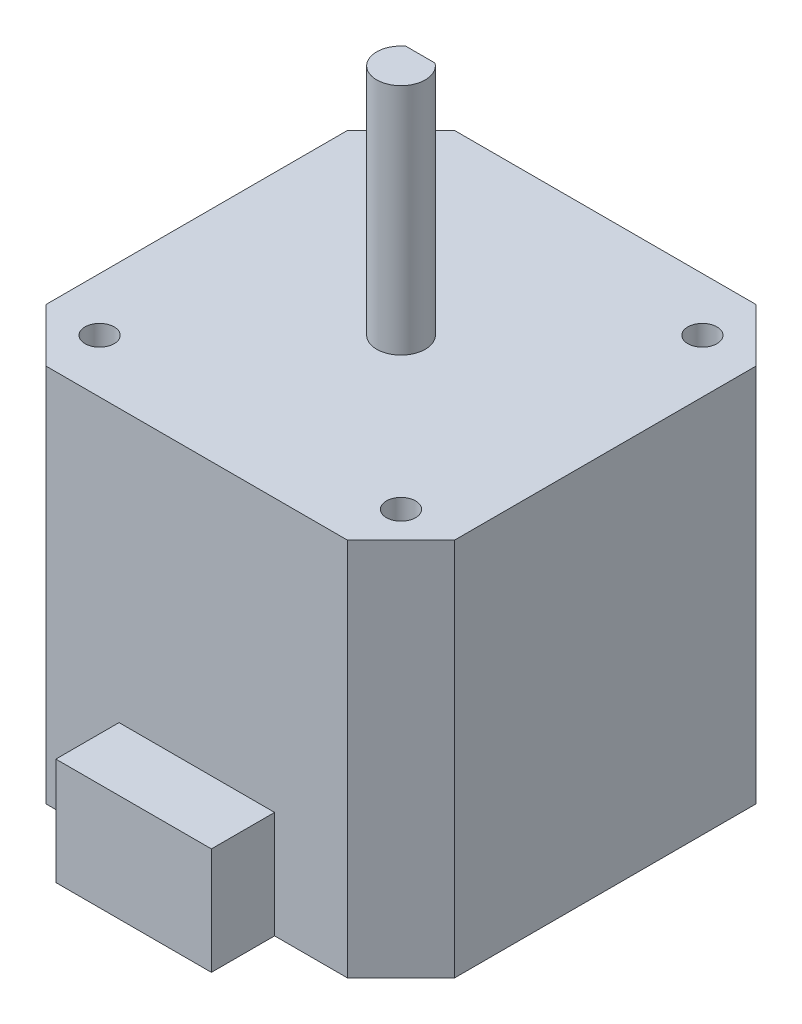
ISO-10303-21;
HEADER;
FILE_DESCRIPTION(('STEP AP214'),'2;1');
FILE_NAME('part.step','',(''),(''),'','','');
FILE_SCHEMA(('AUTOMOTIVE_DESIGN { 1 0 10303 214 1 1 1 1 }'));
ENDSEC;
DATA;
#1=APPLICATION_CONTEXT('core data for automotive mechanical design processes');
#2=APPLICATION_PROTOCOL_DEFINITION('international standard','automotive_design',2000,#1);
#3=PRODUCT_CONTEXT('',#1,'mechanical');
#4=PRODUCT('Part','Part','',(#3));
#5=PRODUCT_RELATED_PRODUCT_CATEGORY('part','',(#4));
#6=PRODUCT_DEFINITION_FORMATION('','',#4);
#7=PRODUCT_DEFINITION_CONTEXT('part definition',#1,'design');
#8=PRODUCT_DEFINITION('design','',#6,#7);
#9=PRODUCT_DEFINITION_SHAPE('','',#8);
#10=(LENGTH_UNIT() NAMED_UNIT(*) SI_UNIT(.MILLI.,.METRE.));
#11=(NAMED_UNIT(*) PLANE_ANGLE_UNIT() SI_UNIT($,.RADIAN.));
#12=(NAMED_UNIT(*) SI_UNIT($,.STERADIAN.) SOLID_ANGLE_UNIT());
#13=UNCERTAINTY_MEASURE_WITH_UNIT(LENGTH_MEASURE(1.E-05),#10,'distance_accuracy_value','');
#14=(GEOMETRIC_REPRESENTATION_CONTEXT(3) GLOBAL_UNCERTAINTY_ASSIGNED_CONTEXT((#13)) GLOBAL_UNIT_ASSIGNED_CONTEXT((#10,
#11,#12)) REPRESENTATION_CONTEXT('',''));
#15=CARTESIAN_POINT('',(0.,0.,0.));
#16=DIRECTION('',(0.,0.,1.));
#17=DIRECTION('',(1.,0.,0.));
#18=AXIS2_PLACEMENT_3D('',#15,#16,#17);
#19=CARTESIAN_POINT('',(-15.5,39.,21.));
#20=DIRECTION('',(0.,0.,-1.));
#21=DIRECTION('',(-1.,0.,0.));
#22=AXIS2_PLACEMENT_3D('',#19,#20,#21);
#23=PLANE('',#22);
#24=DIRECTION('',(0.,-1.,0.));
#25=VECTOR('',#24,1.);
#26=CARTESIAN_POINT('',(-8.,0.,21.));
#27=LINE('',#26,#25);
#28=CARTESIAN_POINT('',(-8.,11.,21.));
#29=VERTEX_POINT('',#28);
#30=CARTESIAN_POINT('',(-8.,0.,21.));
#31=VERTEX_POINT('',#30);
#32=EDGE_CURVE('E57',#29,#31,#27,.T.);
#33=ORIENTED_EDGE('',*,*,#32,.F.);
#34=DIRECTION('',(-1.,0.,0.));
#35=VECTOR('',#34,1.);
#36=CARTESIAN_POINT('',(-8.,11.,21.));
#37=LINE('',#36,#35);
#38=CARTESIAN_POINT('',(8.,11.,21.));
#39=VERTEX_POINT('',#38);
#40=EDGE_CURVE('E163',#39,#29,#37,.T.);
#41=ORIENTED_EDGE('',*,*,#40,.F.);
#42=DIRECTION('',(0.,1.,0.));
#43=VECTOR('',#42,1.);
#44=CARTESIAN_POINT('',(8.,0.,21.));
#45=LINE('',#44,#43);
#46=CARTESIAN_POINT('',(8.,0.,21.));
#47=VERTEX_POINT('',#46);
#48=EDGE_CURVE('E63',#47,#39,#45,.T.);
#49=ORIENTED_EDGE('',*,*,#48,.F.);
#50=DIRECTION('',(1.,0.,0.));
#51=VECTOR('',#50,1.);
#52=CARTESIAN_POINT('',(-15.5,0.,21.));
#53=LINE('',#52,#51);
#54=CARTESIAN_POINT('',(15.5,0.,21.));
#55=VERTEX_POINT('',#54);
#56=EDGE_CURVE('E235',#47,#55,#53,.T.);
#57=ORIENTED_EDGE('',*,*,#56,.T.);
#58=DIRECTION('',(0.,-1.,0.));
#59=VECTOR('',#58,1.);
#60=CARTESIAN_POINT('',(15.5,39.,21.));
#61=LINE('',#60,#59);
#62=CARTESIAN_POINT('',(15.5,39.,21.));
#63=VERTEX_POINT('',#62);
#64=EDGE_CURVE('E261',#63,#55,#61,.T.);
#65=ORIENTED_EDGE('',*,*,#64,.F.);
#66=DIRECTION('',(1.,0.,0.));
#67=VECTOR('',#66,1.);
#68=CARTESIAN_POINT('',(-15.5,39.,21.));
#69=LINE('',#68,#67);
#70=CARTESIAN_POINT('',(-15.5,39.,21.));
#71=VERTEX_POINT('',#70);
#72=EDGE_CURVE('E218',#71,#63,#69,.T.);
#73=ORIENTED_EDGE('',*,*,#72,.F.);
#74=DIRECTION('',(0.,-1.,0.));
#75=VECTOR('',#74,1.);
#76=CARTESIAN_POINT('',(-15.5,39.,21.));
#77=LINE('',#76,#75);
#78=CARTESIAN_POINT('',(-15.5,0.,21.));
#79=VERTEX_POINT('',#78);
#80=EDGE_CURVE('E264',#71,#79,#77,.T.);
#81=ORIENTED_EDGE('',*,*,#80,.T.);
#82=EDGE_CURVE('E236',#79,#31,#53,.T.);
#83=ORIENTED_EDGE('',*,*,#82,.T.);
#84=EDGE_LOOP('',(#33,#41,#49,#57,#65,#73,#81,#83));
#85=FACE_BOUND('',#84,.T.);
#86=ADVANCED_FACE('F42',(#85),#23,.F.);
#87=CARTESIAN_POINT('',(-21.,39.,15.5));
#88=DIRECTION('',(1.,0.,0.));
#89=DIRECTION('',(0.,0.,-1.));
#90=AXIS2_PLACEMENT_3D('',#87,#88,#89);
#91=PLANE('',#90);
#92=DIRECTION('',(0.,0.,1.));
#93=VECTOR('',#92,1.);
#94=CARTESIAN_POINT('',(-21.,0.,15.5));
#95=LINE('',#94,#93);
#96=CARTESIAN_POINT('',(-21.,0.,-15.5));
#97=VERTEX_POINT('',#96);
#98=CARTESIAN_POINT('',(-21.,0.,15.5));
#99=VERTEX_POINT('',#98);
#100=EDGE_CURVE('E211',#97,#99,#95,.T.);
#101=ORIENTED_EDGE('',*,*,#100,.T.);
#102=DIRECTION('',(0.,-1.,0.));
#103=VECTOR('',#102,1.);
#104=CARTESIAN_POINT('',(-21.,39.,15.5));
#105=LINE('',#104,#103);
#106=CARTESIAN_POINT('',(-21.,39.,15.5));
#107=VERTEX_POINT('',#106);
#108=EDGE_CURVE('E50',#107,#99,#105,.T.);
#109=ORIENTED_EDGE('',*,*,#108,.F.);
#110=DIRECTION('',(0.,0.,1.));
#111=VECTOR('',#110,1.);
#112=CARTESIAN_POINT('',(-21.,39.,15.5));
#113=LINE('',#112,#111);
#114=CARTESIAN_POINT('',(-21.,39.,-15.5));
#115=VERTEX_POINT('',#114);
#116=EDGE_CURVE('E212',#115,#107,#113,.T.);
#117=ORIENTED_EDGE('',*,*,#116,.F.);
#118=DIRECTION('',(0.,-1.,0.));
#119=VECTOR('',#118,1.);
#120=CARTESIAN_POINT('',(-21.,39.,-15.5));
#121=LINE('',#120,#119);
#122=EDGE_CURVE('E230',#115,#97,#121,.T.);
#123=ORIENTED_EDGE('',*,*,#122,.T.);
#124=EDGE_LOOP('',(#101,#109,#117,#123));
#125=FACE_BOUND('',#124,.T.);
#126=ADVANCED_FACE('F44',(#125),#91,.F.);
#127=CARTESIAN_POINT('',(-21.,39.,15.5));
#128=DIRECTION('',(0.707106781186549,0.,-0.707106781186546));
#129=DIRECTION('',(-0.707106781186546,0.,-0.707106781186549));
#130=AXIS2_PLACEMENT_3D('',#127,#128,#129);
#131=PLANE('',#130);
#132=DIRECTION('',(0.707106781186546,0.,0.707106781186549));
#133=VECTOR('',#132,1.);
#134=CARTESIAN_POINT('',(-21.,0.,15.5));
#135=LINE('',#134,#133);
#136=EDGE_CURVE('E233',#99,#79,#135,.T.);
#137=ORIENTED_EDGE('',*,*,#136,.T.);
#138=ORIENTED_EDGE('',*,*,#80,.F.);
#139=DIRECTION('',(0.707106781186546,0.,0.707106781186549));
#140=VECTOR('',#139,1.);
#141=CARTESIAN_POINT('',(-21.,39.,15.5));
#142=LINE('',#141,#140);
#143=EDGE_CURVE('E215',#107,#71,#142,.T.);
#144=ORIENTED_EDGE('',*,*,#143,.F.);
#145=ORIENTED_EDGE('',*,*,#108,.T.);
#146=EDGE_LOOP('',(#137,#138,#144,#145));
#147=FACE_BOUND('',#146,.T.);
#148=ADVANCED_FACE('F269',(#147),#131,.F.);
#149=CARTESIAN_POINT('',(15.5,39.,21.));
#150=DIRECTION('',(-0.707106781186549,0.,-0.707106781186546));
#151=DIRECTION('',(-0.707106781186546,0.,0.707106781186549));
#152=AXIS2_PLACEMENT_3D('',#149,#150,#151);
#153=PLANE('',#152);
#154=DIRECTION('',(0.707106781186546,0.,-0.707106781186549));
#155=VECTOR('',#154,1.);
#156=CARTESIAN_POINT('',(15.5,0.,21.));
#157=LINE('',#156,#155);
#158=CARTESIAN_POINT('',(21.,0.,15.5));
#159=VERTEX_POINT('',#158);
#160=EDGE_CURVE('E238',#55,#159,#157,.T.);
#161=ORIENTED_EDGE('',*,*,#160,.T.);
#162=DIRECTION('',(0.,-1.,0.));
#163=VECTOR('',#162,1.);
#164=CARTESIAN_POINT('',(21.,39.,15.5));
#165=LINE('',#164,#163);
#166=CARTESIAN_POINT('',(21.,39.,15.5));
#167=VERTEX_POINT('',#166);
#168=EDGE_CURVE('E258',#167,#159,#165,.T.);
#169=ORIENTED_EDGE('',*,*,#168,.F.);
#170=DIRECTION('',(0.707106781186546,0.,-0.707106781186549));
#171=VECTOR('',#170,1.);
#172=CARTESIAN_POINT('',(15.5,39.,21.));
#173=LINE('',#172,#171);
#174=EDGE_CURVE('E220',#63,#167,#173,.T.);
#175=ORIENTED_EDGE('',*,*,#174,.F.);
#176=ORIENTED_EDGE('',*,*,#64,.T.);
#177=EDGE_LOOP('',(#161,#169,#175,#176));
#178=FACE_BOUND('',#177,.T.);
#179=ADVANCED_FACE('F301',(#178),#153,.F.);
#180=CARTESIAN_POINT('',(21.,39.,15.5));
#181=DIRECTION('',(-1.,0.,0.));
#182=DIRECTION('',(0.,0.,1.));
#183=AXIS2_PLACEMENT_3D('',#180,#181,#182);
#184=PLANE('',#183);
#185=DIRECTION('',(0.,0.,-1.));
#186=VECTOR('',#185,1.);
#187=CARTESIAN_POINT('',(21.,0.,15.5));
#188=LINE('',#187,#186);
#189=CARTESIAN_POINT('',(21.,0.,-15.5));
#190=VERTEX_POINT('',#189);
#191=EDGE_CURVE('E240',#159,#190,#188,.T.);
#192=ORIENTED_EDGE('',*,*,#191,.T.);
#193=DIRECTION('',(0.,-1.,0.));
#194=VECTOR('',#193,1.);
#195=CARTESIAN_POINT('',(21.,39.,-15.5));
#196=LINE('',#195,#194);
#197=CARTESIAN_POINT('',(21.,39.,-15.5));
#198=VERTEX_POINT('',#197);
#199=EDGE_CURVE('E255',#198,#190,#196,.T.);
#200=ORIENTED_EDGE('',*,*,#199,.F.);
#201=DIRECTION('',(0.,0.,-1.));
#202=VECTOR('',#201,1.);
#203=CARTESIAN_POINT('',(21.,39.,15.5));
#204=LINE('',#203,#202);
#205=EDGE_CURVE('E222',#167,#198,#204,.T.);
#206=ORIENTED_EDGE('',*,*,#205,.F.);
#207=ORIENTED_EDGE('',*,*,#168,.T.);
#208=EDGE_LOOP('',(#192,#200,#206,#207));
#209=FACE_BOUND('',#208,.T.);
#210=ADVANCED_FACE('F299',(#209),#184,.F.);
#211=CARTESIAN_POINT('',(15.5,39.,-21.));
#212=DIRECTION('',(-0.707106781186549,0.,0.707106781186546));
#213=DIRECTION('',(0.707106781186546,0.,0.707106781186549));
#214=AXIS2_PLACEMENT_3D('',#211,#212,#213);
#215=PLANE('',#214);
#216=DIRECTION('',(-0.707106781186546,0.,-0.707106781186549));
#217=VECTOR('',#216,1.);
#218=CARTESIAN_POINT('',(15.5,0.,-21.));
#219=LINE('',#218,#217);
#220=CARTESIAN_POINT('',(15.5,0.,-21.));
#221=VERTEX_POINT('',#220);
#222=EDGE_CURVE('E242',#190,#221,#219,.T.);
#223=ORIENTED_EDGE('',*,*,#222,.T.);
#224=DIRECTION('',(0.,-1.,0.));
#225=VECTOR('',#224,1.);
#226=CARTESIAN_POINT('',(15.5,39.,-21.));
#227=LINE('',#226,#225);
#228=CARTESIAN_POINT('',(15.5,39.,-21.));
#229=VERTEX_POINT('',#228);
#230=EDGE_CURVE('E252',#229,#221,#227,.T.);
#231=ORIENTED_EDGE('',*,*,#230,.F.);
#232=DIRECTION('',(-0.707106781186546,0.,-0.707106781186549));
#233=VECTOR('',#232,1.);
#234=CARTESIAN_POINT('',(15.5,39.,-21.));
#235=LINE('',#234,#233);
#236=EDGE_CURVE('E224',#198,#229,#235,.T.);
#237=ORIENTED_EDGE('',*,*,#236,.F.);
#238=ORIENTED_EDGE('',*,*,#199,.T.);
#239=EDGE_LOOP('',(#223,#231,#237,#238));
#240=FACE_BOUND('',#239,.T.);
#241=ADVANCED_FACE('F294',(#240),#215,.F.);
#242=CARTESIAN_POINT('',(-15.5,39.,-21.));
#243=DIRECTION('',(0.,0.,1.));
#244=DIRECTION('',(1.,0.,0.));
#245=AXIS2_PLACEMENT_3D('',#242,#243,#244);
#246=PLANE('',#245);
#247=DIRECTION('',(-1.,0.,0.));
#248=VECTOR('',#247,1.);
#249=CARTESIAN_POINT('',(-15.5,0.,-21.));
#250=LINE('',#249,#248);
#251=CARTESIAN_POINT('',(-15.5,0.,-21.));
#252=VERTEX_POINT('',#251);
#253=EDGE_CURVE('E244',#221,#252,#250,.T.);
#254=ORIENTED_EDGE('',*,*,#253,.T.);
#255=DIRECTION('',(0.,-1.,0.));
#256=VECTOR('',#255,1.);
#257=CARTESIAN_POINT('',(-15.5,39.,-21.));
#258=LINE('',#257,#256);
#259=CARTESIAN_POINT('',(-15.5,39.,-21.));
#260=VERTEX_POINT('',#259);
#261=EDGE_CURVE('E249',#260,#252,#258,.T.);
#262=ORIENTED_EDGE('',*,*,#261,.F.);
#263=DIRECTION('',(-1.,0.,0.));
#264=VECTOR('',#263,1.);
#265=CARTESIAN_POINT('',(-15.5,39.,-21.));
#266=LINE('',#265,#264);
#267=EDGE_CURVE('E226',#229,#260,#266,.T.);
#268=ORIENTED_EDGE('',*,*,#267,.F.);
#269=ORIENTED_EDGE('',*,*,#230,.T.);
#270=EDGE_LOOP('',(#254,#262,#268,#269));
#271=FACE_BOUND('',#270,.T.);
#272=ADVANCED_FACE('F288',(#271),#246,.F.);
#273=CARTESIAN_POINT('',(-21.,39.,-15.5));
#274=DIRECTION('',(0.707106781186549,0.,0.707106781186546));
#275=DIRECTION('',(0.707106781186546,0.,-0.707106781186549));
#276=AXIS2_PLACEMENT_3D('',#273,#274,#275);
#277=PLANE('',#276);
#278=DIRECTION('',(-0.707106781186546,0.,0.707106781186549));
#279=VECTOR('',#278,1.);
#280=CARTESIAN_POINT('',(-21.,0.,-15.5));
#281=LINE('',#280,#279);
#282=EDGE_CURVE('E216',#252,#97,#281,.T.);
#283=ORIENTED_EDGE('',*,*,#282,.T.);
#284=ORIENTED_EDGE('',*,*,#122,.F.);
#285=DIRECTION('',(-0.707106781186546,0.,0.707106781186549));
#286=VECTOR('',#285,1.);
#287=CARTESIAN_POINT('',(-21.,39.,-15.5));
#288=LINE('',#287,#286);
#289=EDGE_CURVE('E228',#260,#115,#288,.T.);
#290=ORIENTED_EDGE('',*,*,#289,.F.);
#291=ORIENTED_EDGE('',*,*,#261,.T.);
#292=EDGE_LOOP('',(#283,#284,#290,#291));
#293=FACE_BOUND('',#292,.T.);
#294=ADVANCED_FACE('F286',(#293),#277,.F.);
#295=CARTESIAN_POINT('',(0.,39.,0.));
#296=DIRECTION('',(0.,-1.,0.));
#297=DIRECTION('',(0.,0.,-1.));
#298=AXIS2_PLACEMENT_3D('',#295,#296,#297);
#299=PLANE('',#298);
#300=CARTESIAN_POINT('',(-15.5,39.,15.4999999999999));
#301=DIRECTION('',(0.,1.,0.));
#302=DIRECTION('',(0.,0.,1.));
#303=AXIS2_PLACEMENT_3D('',#300,#301,#302);
#304=CIRCLE('',#303,1.5);
#305=CARTESIAN_POINT('',(-15.5,39.,16.9999999999999));
#306=VERTEX_POINT('',#305);
#307=EDGE_CURVE('E169',#306,#306,#304,.T.);
#308=ORIENTED_EDGE('',*,*,#307,.F.);
#309=EDGE_LOOP('',(#308));
#310=FACE_BOUND('',#309,.T.);
#311=CARTESIAN_POINT('',(15.5,39.,15.4999999999999));
#312=DIRECTION('',(0.,1.,0.));
#313=DIRECTION('',(0.,0.,1.));
#314=AXIS2_PLACEMENT_3D('',#311,#312,#313);
#315=CIRCLE('',#314,1.5);
#316=CARTESIAN_POINT('',(15.5,39.,16.9999999999999));
#317=VERTEX_POINT('',#316);
#318=EDGE_CURVE('E182',#317,#317,#315,.T.);
#319=ORIENTED_EDGE('',*,*,#318,.F.);
#320=EDGE_LOOP('',(#319));
#321=FACE_BOUND('',#320,.T.);
#322=CARTESIAN_POINT('',(15.5,39.,-15.5));
#323=DIRECTION('',(0.,1.,0.));
#324=DIRECTION('',(0.,0.,1.));
#325=AXIS2_PLACEMENT_3D('',#322,#323,#324);
#326=CIRCLE('',#325,1.5);
#327=CARTESIAN_POINT('',(15.5,39.,-14.));
#328=VERTEX_POINT('',#327);
#329=EDGE_CURVE('E175',#328,#328,#326,.T.);
#330=ORIENTED_EDGE('',*,*,#329,.F.);
#331=EDGE_LOOP('',(#330));
#332=FACE_BOUND('',#331,.T.);
#333=CARTESIAN_POINT('',(-15.5,39.,-15.5));
#334=DIRECTION('',(0.,1.,0.));
#335=DIRECTION('',(0.,0.,1.));
#336=AXIS2_PLACEMENT_3D('',#333,#334,#335);
#337=CIRCLE('',#336,1.5);
#338=CARTESIAN_POINT('',(-15.5,39.,-14.));
#339=VERTEX_POINT('',#338);
#340=EDGE_CURVE('E178',#339,#339,#337,.T.);
#341=ORIENTED_EDGE('',*,*,#340,.F.);
#342=EDGE_LOOP('',(#341));
#343=FACE_BOUND('',#342,.T.);
#344=CARTESIAN_POINT('',(0.,39.,0.));
#345=DIRECTION('',(0.,-1.,0.));
#346=DIRECTION('',(0.,0.,-1.));
#347=AXIS2_PLACEMENT_3D('',#344,#345,#346);
#348=CIRCLE('',#347,2.5);
#349=CARTESIAN_POINT('',(0.,39.,-2.5));
#350=VERTEX_POINT('',#349);
#351=EDGE_CURVE('E11',#350,#350,#348,.F.);
#352=ORIENTED_EDGE('',*,*,#351,.F.);
#353=EDGE_LOOP('',(#352));
#354=FACE_BOUND('',#353,.T.);
#355=ORIENTED_EDGE('',*,*,#116,.T.);
#356=ORIENTED_EDGE('',*,*,#143,.T.);
#357=ORIENTED_EDGE('',*,*,#72,.T.);
#358=ORIENTED_EDGE('',*,*,#174,.T.);
#359=ORIENTED_EDGE('',*,*,#205,.T.);
#360=ORIENTED_EDGE('',*,*,#236,.T.);
#361=ORIENTED_EDGE('',*,*,#267,.T.);
#362=ORIENTED_EDGE('',*,*,#289,.T.);
#363=EDGE_LOOP('',(#355,#356,#357,#358,#359,#360,#361,#362));
#364=FACE_BOUND('',#363,.T.);
#365=ADVANCED_FACE('F280',(#310,#321,#332,#343,#354,#364),#299,.F.);
#366=CARTESIAN_POINT('',(0.,0.,0.));
#367=DIRECTION('',(0.,-1.,0.));
#368=DIRECTION('',(0.,0.,-1.));
#369=AXIS2_PLACEMENT_3D('',#366,#367,#368);
#370=PLANE('',#369);
#371=ORIENTED_EDGE('',*,*,#100,.F.);
#372=ORIENTED_EDGE('',*,*,#282,.F.);
#373=ORIENTED_EDGE('',*,*,#253,.F.);
#374=ORIENTED_EDGE('',*,*,#222,.F.);
#375=ORIENTED_EDGE('',*,*,#191,.F.);
#376=ORIENTED_EDGE('',*,*,#160,.F.);
#377=ORIENTED_EDGE('',*,*,#56,.F.);
#378=DIRECTION('',(0.,0.,-1.));
#379=VECTOR('',#378,1.);
#380=CARTESIAN_POINT('',(8.,0.,27.5));
#381=LINE('',#380,#379);
#382=CARTESIAN_POINT('',(8.,0.,27.5));
#383=VERTEX_POINT('',#382);
#384=EDGE_CURVE('E150',#383,#47,#381,.T.);
#385=ORIENTED_EDGE('',*,*,#384,.F.);
#386=DIRECTION('',(1.,0.,0.));
#387=VECTOR('',#386,1.);
#388=CARTESIAN_POINT('',(-8.,0.,27.5));
#389=LINE('',#388,#387);
#390=CARTESIAN_POINT('',(-8.,0.,27.5));
#391=VERTEX_POINT('',#390);
#392=EDGE_CURVE('E142',#391,#383,#389,.T.);
#393=ORIENTED_EDGE('',*,*,#392,.F.);
#394=DIRECTION('',(0.,0.,-1.));
#395=VECTOR('',#394,1.);
#396=CARTESIAN_POINT('',(-8.,0.,27.5));
#397=LINE('',#396,#395);
#398=EDGE_CURVE('E148',#391,#31,#397,.T.);
#399=ORIENTED_EDGE('',*,*,#398,.T.);
#400=ORIENTED_EDGE('',*,*,#82,.F.);
#401=ORIENTED_EDGE('',*,*,#136,.F.);
#402=EDGE_LOOP('',(#371,#372,#373,#374,#375,#376,#377,#385,#393,#399,#400,#401));
#403=FACE_BOUND('',#402,.T.);
#404=ADVANCED_FACE('F145',(#403),#370,.T.);
#405=CARTESIAN_POINT('',(0.,48.,0.));
#406=DIRECTION('',(0.,-1.,0.));
#407=DIRECTION('',(0.,0.,-1.));
#408=AXIS2_PLACEMENT_3D('',#405,#406,#407);
#409=CYLINDRICAL_SURFACE('',#408,2.5);
#410=CARTESIAN_POINT('',(0.,48.,0.));
#411=DIRECTION('',(0.,1.,0.));
#412=DIRECTION('',(0.,0.,1.));
#413=AXIS2_PLACEMENT_3D('',#410,#411,#412);
#414=CIRCLE('',#413,2.5);
#415=CARTESIAN_POINT('',(1.5,48.,-2.));
#416=VERTEX_POINT('',#415);
#417=CARTESIAN_POINT('',(-1.5,48.,-2.));
#418=VERTEX_POINT('',#417);
#419=EDGE_CURVE('E209',#416,#418,#414,.T.);
#420=ORIENTED_EDGE('',*,*,#419,.F.);
#421=DIRECTION('',(0.,-1.,0.));
#422=VECTOR('',#421,1.);
#423=CARTESIAN_POINT('',(1.5,63.,-2.));
#424=LINE('',#423,#422);
#425=CARTESIAN_POINT('',(1.5,63.,-2.));
#426=VERTEX_POINT('',#425);
#427=EDGE_CURVE('E206',#426,#416,#424,.T.);
#428=ORIENTED_EDGE('',*,*,#427,.F.);
#429=CARTESIAN_POINT('',(0.,63.,0.));
#430=DIRECTION('',(0.,1.,0.));
#431=DIRECTION('',(0.,0.,1.));
#432=AXIS2_PLACEMENT_3D('',#429,#430,#431);
#433=CIRCLE('',#432,2.5);
#434=CARTESIAN_POINT('',(-1.5,63.,-2.));
#435=VERTEX_POINT('',#434);
#436=EDGE_CURVE('E196',#435,#426,#433,.T.);
#437=ORIENTED_EDGE('',*,*,#436,.F.);
#438=DIRECTION('',(0.,-1.,0.));
#439=VECTOR('',#438,1.);
#440=CARTESIAN_POINT('',(-1.5,63.,-2.));
#441=LINE('',#440,#439);
#442=EDGE_CURVE('E201',#435,#418,#441,.T.);
#443=ORIENTED_EDGE('',*,*,#442,.T.);
#444=EDGE_LOOP('',(#420,#428,#437,#443));
#445=FACE_BOUND('',#444,.T.);
#446=ORIENTED_EDGE('',*,*,#351,.T.);
#447=EDGE_LOOP('',(#446));
#448=FACE_BOUND('',#447,.T.);
#449=ADVANCED_FACE('F350',(#445,#448),#409,.T.);
#450=CARTESIAN_POINT('',(0.,48.,0.));
#451=DIRECTION('',(0.,1.,0.));
#452=DIRECTION('',(0.,0.,1.));
#453=AXIS2_PLACEMENT_3D('',#450,#451,#452);
#454=PLANE('',#453);
#455=DIRECTION('',(-1.,0.,0.));
#456=VECTOR('',#455,1.);
#457=CARTESIAN_POINT('',(-1.5,48.,-2.));
#458=LINE('',#457,#456);
#459=EDGE_CURVE('E193',#416,#418,#458,.T.);
#460=ORIENTED_EDGE('',*,*,#459,.F.);
#461=ORIENTED_EDGE('',*,*,#419,.T.);
#462=EDGE_LOOP('',(#460,#461));
#463=FACE_BOUND('',#462,.T.);
#464=ADVANCED_FACE('F356',(#463),#454,.T.);
#465=CARTESIAN_POINT('',(-1.5,63.,-2.));
#466=DIRECTION('',(0.,0.,1.));
#467=DIRECTION('',(1.,0.,0.));
#468=AXIS2_PLACEMENT_3D('',#465,#466,#467);
#469=PLANE('',#468);
#470=ORIENTED_EDGE('',*,*,#459,.T.);
#471=ORIENTED_EDGE('',*,*,#442,.F.);
#472=DIRECTION('',(-1.,0.,0.));
#473=VECTOR('',#472,1.);
#474=CARTESIAN_POINT('',(-1.5,63.,-2.));
#475=LINE('',#474,#473);
#476=EDGE_CURVE('E199',#426,#435,#475,.T.);
#477=ORIENTED_EDGE('',*,*,#476,.F.);
#478=ORIENTED_EDGE('',*,*,#427,.T.);
#479=EDGE_LOOP('',(#470,#471,#477,#478));
#480=FACE_BOUND('',#479,.T.);
#481=ADVANCED_FACE('F360',(#480),#469,.F.);
#482=CARTESIAN_POINT('',(0.,63.,0.));
#483=DIRECTION('',(0.,1.,0.));
#484=DIRECTION('',(0.,0.,1.));
#485=AXIS2_PLACEMENT_3D('',#482,#483,#484);
#486=PLANE('',#485);
#487=ORIENTED_EDGE('',*,*,#436,.T.);
#488=ORIENTED_EDGE('',*,*,#476,.T.);
#489=EDGE_LOOP('',(#487,#488));
#490=FACE_BOUND('',#489,.T.);
#491=ADVANCED_FACE('F364',(#490),#486,.T.);
#492=CARTESIAN_POINT('',(-15.5,34.5,-15.5));
#493=DIRECTION('',(0.,1.,0.));
#494=DIRECTION('',(0.,0.,1.));
#495=AXIS2_PLACEMENT_3D('',#492,#493,#494);
#496=CYLINDRICAL_SURFACE('',#495,1.5);
#497=CARTESIAN_POINT('',(-15.5,34.5,-15.5));
#498=DIRECTION('',(0.,1.,0.));
#499=DIRECTION('',(0.,0.,1.));
#500=AXIS2_PLACEMENT_3D('',#497,#498,#499);
#501=CIRCLE('',#500,1.5);
#502=CARTESIAN_POINT('',(-15.5,34.5,-14.));
#503=VERTEX_POINT('',#502);
#504=EDGE_CURVE('E190',#503,#503,#501,.T.);
#505=ORIENTED_EDGE('',*,*,#504,.F.);
#506=EDGE_LOOP('',(#505));
#507=FACE_BOUND('',#506,.T.);
#508=ORIENTED_EDGE('',*,*,#340,.T.);
#509=EDGE_LOOP('',(#508));
#510=FACE_BOUND('',#509,.T.);
#511=ADVANCED_FACE('F368',(#507,#510),#496,.F.);
#512=CARTESIAN_POINT('',(-15.5,34.5,-15.5));
#513=DIRECTION('',(0.,1.,0.));
#514=DIRECTION('',(0.,0.,1.));
#515=AXIS2_PLACEMENT_3D('',#512,#513,#514);
#516=PLANE('',#515);
#517=ORIENTED_EDGE('',*,*,#504,.T.);
#518=EDGE_LOOP('',(#517));
#519=FACE_BOUND('',#518,.T.);
#520=ADVANCED_FACE('F372',(#519),#516,.T.);
#521=CARTESIAN_POINT('',(15.5,34.5,-15.5));
#522=DIRECTION('',(0.,1.,0.));
#523=DIRECTION('',(0.,0.,1.));
#524=AXIS2_PLACEMENT_3D('',#521,#522,#523);
#525=CYLINDRICAL_SURFACE('',#524,1.5);
#526=CARTESIAN_POINT('',(15.5,34.5,-15.5));
#527=DIRECTION('',(0.,1.,0.));
#528=DIRECTION('',(0.,0.,1.));
#529=AXIS2_PLACEMENT_3D('',#526,#527,#528);
#530=CIRCLE('',#529,1.5);
#531=CARTESIAN_POINT('',(15.5,34.5,-14.));
#532=VERTEX_POINT('',#531);
#533=EDGE_CURVE('E179',#532,#532,#530,.T.);
#534=ORIENTED_EDGE('',*,*,#533,.F.);
#535=EDGE_LOOP('',(#534));
#536=FACE_BOUND('',#535,.T.);
#537=ORIENTED_EDGE('',*,*,#329,.T.);
#538=EDGE_LOOP('',(#537));
#539=FACE_BOUND('',#538,.T.);
#540=ADVANCED_FACE('F376',(#536,#539),#525,.F.);
#541=CARTESIAN_POINT('',(15.5,34.5,-15.5));
#542=DIRECTION('',(0.,1.,0.));
#543=DIRECTION('',(0.,0.,1.));
#544=AXIS2_PLACEMENT_3D('',#541,#542,#543);
#545=PLANE('',#544);
#546=ORIENTED_EDGE('',*,*,#533,.T.);
#547=EDGE_LOOP('',(#546));
#548=FACE_BOUND('',#547,.T.);
#549=ADVANCED_FACE('F393',(#548),#545,.T.);
#550=CARTESIAN_POINT('',(15.5,34.5,15.4999999999999));
#551=DIRECTION('',(0.,1.,0.));
#552=DIRECTION('',(0.,0.,1.));
#553=AXIS2_PLACEMENT_3D('',#550,#551,#552);
#554=CYLINDRICAL_SURFACE('',#553,1.5);
#555=CARTESIAN_POINT('',(15.5,34.5,15.4999999999999));
#556=DIRECTION('',(0.,1.,0.));
#557=DIRECTION('',(0.,0.,1.));
#558=AXIS2_PLACEMENT_3D('',#555,#556,#557);
#559=CIRCLE('',#558,1.5);
#560=CARTESIAN_POINT('',(15.5,34.5,16.9999999999999));
#561=VERTEX_POINT('',#560);
#562=EDGE_CURVE('E185',#561,#561,#559,.T.);
#563=ORIENTED_EDGE('',*,*,#562,.F.);
#564=EDGE_LOOP('',(#563));
#565=FACE_BOUND('',#564,.T.);
#566=ORIENTED_EDGE('',*,*,#318,.T.);
#567=EDGE_LOOP('',(#566));
#568=FACE_BOUND('',#567,.T.);
#569=ADVANCED_FACE('F389',(#565,#568),#554,.F.);
#570=CARTESIAN_POINT('',(15.5,34.5,15.4999999999999));
#571=DIRECTION('',(0.,1.,0.));
#572=DIRECTION('',(0.,0.,1.));
#573=AXIS2_PLACEMENT_3D('',#570,#571,#572);
#574=PLANE('',#573);
#575=ORIENTED_EDGE('',*,*,#562,.T.);
#576=EDGE_LOOP('',(#575));
#577=FACE_BOUND('',#576,.T.);
#578=ADVANCED_FACE('F385',(#577),#574,.T.);
#579=CARTESIAN_POINT('',(-15.5,34.5,15.4999999999999));
#580=DIRECTION('',(0.,1.,0.));
#581=DIRECTION('',(0.,0.,1.));
#582=AXIS2_PLACEMENT_3D('',#579,#580,#581);
#583=CYLINDRICAL_SURFACE('',#582,1.5);
#584=CARTESIAN_POINT('',(-15.5,34.5,15.4999999999999));
#585=DIRECTION('',(0.,1.,0.));
#586=DIRECTION('',(0.,0.,1.));
#587=AXIS2_PLACEMENT_3D('',#584,#585,#586);
#588=CIRCLE('',#587,1.5);
#589=CARTESIAN_POINT('',(-15.5,34.5,16.9999999999999));
#590=VERTEX_POINT('',#589);
#591=EDGE_CURVE('E166',#590,#590,#588,.T.);
#592=ORIENTED_EDGE('',*,*,#591,.F.);
#593=EDGE_LOOP('',(#592));
#594=FACE_BOUND('',#593,.T.);
#595=ORIENTED_EDGE('',*,*,#307,.T.);
#596=EDGE_LOOP('',(#595));
#597=FACE_BOUND('',#596,.T.);
#598=ADVANCED_FACE('F381',(#594,#597),#583,.F.);
#599=CARTESIAN_POINT('',(-15.5,34.5,15.4999999999999));
#600=DIRECTION('',(0.,1.,0.));
#601=DIRECTION('',(0.,0.,1.));
#602=AXIS2_PLACEMENT_3D('',#599,#600,#601);
#603=PLANE('',#602);
#604=ORIENTED_EDGE('',*,*,#591,.T.);
#605=EDGE_LOOP('',(#604));
#606=FACE_BOUND('',#605,.T.);
#607=ADVANCED_FACE('F378',(#606),#603,.T.);
#608=CARTESIAN_POINT('',(-8.,0.,27.5));
#609=DIRECTION('',(1.,0.,0.));
#610=DIRECTION('',(0.,0.,-1.));
#611=AXIS2_PLACEMENT_3D('',#608,#609,#610);
#612=PLANE('',#611);
#613=ORIENTED_EDGE('',*,*,#32,.T.);
#614=ORIENTED_EDGE('',*,*,#398,.F.);
#615=DIRECTION('',(0.,-1.,0.));
#616=VECTOR('',#615,1.);
#617=CARTESIAN_POINT('',(-8.,0.,27.5));
#618=LINE('',#617,#616);
#619=CARTESIAN_POINT('',(-8.,11.,27.5));
#620=VERTEX_POINT('',#619);
#621=EDGE_CURVE('E154',#620,#391,#618,.T.);
#622=ORIENTED_EDGE('',*,*,#621,.F.);
#623=DIRECTION('',(0.,0.,-1.));
#624=VECTOR('',#623,1.);
#625=CARTESIAN_POINT('',(-8.,11.,27.5));
#626=LINE('',#625,#624);
#627=EDGE_CURVE('E307',#620,#29,#626,.T.);
#628=ORIENTED_EDGE('',*,*,#627,.T.);
#629=EDGE_LOOP('',(#613,#614,#622,#628));
#630=FACE_BOUND('',#629,.T.);
#631=ADVANCED_FACE('F165',(#630),#612,.F.);
#632=CARTESIAN_POINT('',(8.,0.,27.5));
#633=DIRECTION('',(-1.,0.,0.));
#634=DIRECTION('',(0.,0.,1.));
#635=AXIS2_PLACEMENT_3D('',#632,#633,#634);
#636=PLANE('',#635);
#637=ORIENTED_EDGE('',*,*,#48,.T.);
#638=DIRECTION('',(0.,0.,-1.));
#639=VECTOR('',#638,1.);
#640=CARTESIAN_POINT('',(8.,11.,27.5));
#641=LINE('',#640,#639);
#642=CARTESIAN_POINT('',(8.,11.,27.5));
#643=VERTEX_POINT('',#642);
#644=EDGE_CURVE('E171',#643,#39,#641,.T.);
#645=ORIENTED_EDGE('',*,*,#644,.F.);
#646=DIRECTION('',(0.,1.,0.));
#647=VECTOR('',#646,1.);
#648=CARTESIAN_POINT('',(8.,0.,27.5));
#649=LINE('',#648,#647);
#650=EDGE_CURVE('E153',#383,#643,#649,.T.);
#651=ORIENTED_EDGE('',*,*,#650,.F.);
#652=ORIENTED_EDGE('',*,*,#384,.T.);
#653=EDGE_LOOP('',(#637,#645,#651,#652));
#654=FACE_BOUND('',#653,.T.);
#655=ADVANCED_FACE('F303',(#654),#636,.F.);
#656=CARTESIAN_POINT('',(-8.,11.,27.5));
#657=DIRECTION('',(0.,-1.,0.));
#658=DIRECTION('',(0.,0.,-1.));
#659=AXIS2_PLACEMENT_3D('',#656,#657,#658);
#660=PLANE('',#659);
#661=ORIENTED_EDGE('',*,*,#40,.T.);
#662=ORIENTED_EDGE('',*,*,#627,.F.);
#663=DIRECTION('',(-1.,0.,0.));
#664=VECTOR('',#663,1.);
#665=CARTESIAN_POINT('',(-8.,11.,27.5));
#666=LINE('',#665,#664);
#667=EDGE_CURVE('E159',#643,#620,#666,.T.);
#668=ORIENTED_EDGE('',*,*,#667,.F.);
#669=ORIENTED_EDGE('',*,*,#644,.T.);
#670=EDGE_LOOP('',(#661,#662,#668,#669));
#671=FACE_BOUND('',#670,.T.);
#672=ADVANCED_FACE('F314',(#671),#660,.F.);
#673=CARTESIAN_POINT('',(0.,0.,27.5));
#674=DIRECTION('',(0.,0.,-1.));
#675=DIRECTION('',(-1.,0.,0.));
#676=AXIS2_PLACEMENT_3D('',#673,#674,#675);
#677=PLANE('',#676);
#678=ORIENTED_EDGE('',*,*,#621,.T.);
#679=ORIENTED_EDGE('',*,*,#392,.T.);
#680=ORIENTED_EDGE('',*,*,#650,.T.);
#681=ORIENTED_EDGE('',*,*,#667,.T.);
#682=EDGE_LOOP('',(#678,#679,#680,#681));
#683=FACE_BOUND('',#682,.T.);
#684=ADVANCED_FACE('F157',(#683),#677,.F.);
#685=CLOSED_SHELL('',(#86,#126,#148,#179,#210,#241,#272,#294,#365,#404,#449,#464,#481,#491,#511,
#520,#540,#549,#569,#578,#598,#607,#631,#655,#672,#684));
#686=MANIFOLD_SOLID_BREP('B2',#685);
#687=ADVANCED_BREP_SHAPE_REPRESENTATION('',(#18,#686),#14);
#688=SHAPE_DEFINITION_REPRESENTATION(#9,#687);
ENDSEC;
END-ISO-10303-21;
